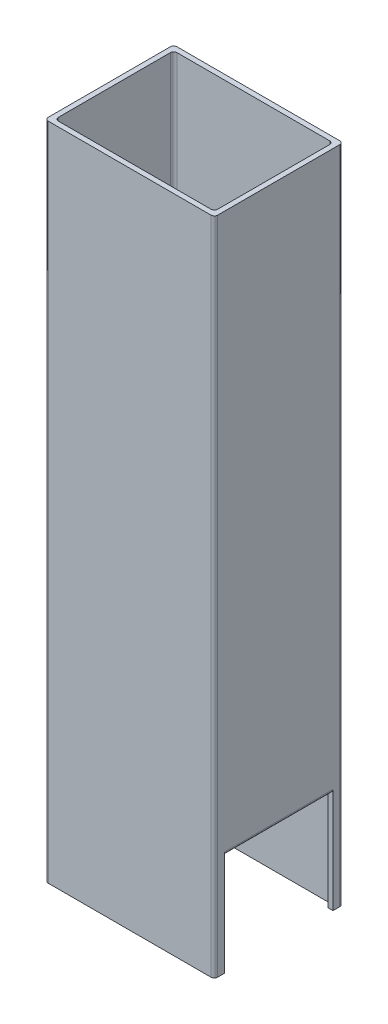
ISO-10303-21;
HEADER;
FILE_DESCRIPTION(('STEP AP214'),'2;1');
FILE_NAME('part.step','',(''),(''),'','','');
FILE_SCHEMA(('AUTOMOTIVE_DESIGN { 1 0 10303 214 1 1 1 1 }'));
ENDSEC;
DATA;
#1=APPLICATION_CONTEXT('core data for automotive mechanical design processes');
#2=APPLICATION_PROTOCOL_DEFINITION('international standard','automotive_design',2000,#1);
#3=PRODUCT_CONTEXT('',#1,'mechanical');
#4=PRODUCT('Part','Part','',(#3));
#5=PRODUCT_RELATED_PRODUCT_CATEGORY('part','',(#4));
#6=PRODUCT_DEFINITION_FORMATION('','',#4);
#7=PRODUCT_DEFINITION_CONTEXT('part definition',#1,'design');
#8=PRODUCT_DEFINITION('design','',#6,#7);
#9=PRODUCT_DEFINITION_SHAPE('','',#8);
#10=(LENGTH_UNIT() NAMED_UNIT(*) SI_UNIT(.MILLI.,.METRE.));
#11=(NAMED_UNIT(*) PLANE_ANGLE_UNIT() SI_UNIT($,.RADIAN.));
#12=(NAMED_UNIT(*) SI_UNIT($,.STERADIAN.) SOLID_ANGLE_UNIT());
#13=UNCERTAINTY_MEASURE_WITH_UNIT(LENGTH_MEASURE(1.E-05),#10,'distance_accuracy_value','');
#14=(GEOMETRIC_REPRESENTATION_CONTEXT(3) GLOBAL_UNCERTAINTY_ASSIGNED_CONTEXT((#13)) GLOBAL_UNIT_ASSIGNED_CONTEXT((#10,
#11,#12)) REPRESENTATION_CONTEXT('',''));
#15=CARTESIAN_POINT('',(0.,0.,0.));
#16=DIRECTION('',(0.,0.,1.));
#17=DIRECTION('',(1.,0.,0.));
#18=AXIS2_PLACEMENT_3D('',#15,#16,#17);
#19=CARTESIAN_POINT('',(0.,0.,0.));
#20=DIRECTION('',(0.,-1.,0.));
#21=DIRECTION('',(0.,0.,-1.));
#22=AXIS2_PLACEMENT_3D('',#19,#20,#21);
#23=PLANE('',#22);
#24=DIRECTION('',(1.,0.,0.));
#25=VECTOR('',#24,1.);
#26=CARTESIAN_POINT('',(-50.,0.,38.));
#27=LINE('',#26,#25);
#28=CARTESIAN_POINT('',(-48.,0.,38.));
#29=VERTEX_POINT('',#28);
#30=CARTESIAN_POINT('',(48.,0.,38.));
#31=VERTEX_POINT('',#30);
#32=EDGE_CURVE('E292',#29,#31,#27,.T.);
#33=ORIENTED_EDGE('',*,*,#32,.F.);
#34=CARTESIAN_POINT('',(-48.,0.,36.));
#35=DIRECTION('',(0.,-1.,0.));
#36=DIRECTION('',(0.,0.,-1.));
#37=AXIS2_PLACEMENT_3D('',#34,#35,#36);
#38=CIRCLE('',#37,2.);
#39=CARTESIAN_POINT('',(-50.,0.,36.));
#40=VERTEX_POINT('',#39);
#41=EDGE_CURVE('E356',#29,#40,#38,.T.);
#42=ORIENTED_EDGE('',*,*,#41,.T.);
#43=DIRECTION('',(0.,0.,1.));
#44=VECTOR('',#43,1.);
#45=CARTESIAN_POINT('',(-50.,0.,-38.));
#46=LINE('',#45,#44);
#47=CARTESIAN_POINT('',(-50.,0.,32.));
#48=VERTEX_POINT('',#47);
#49=EDGE_CURVE('E289',#48,#40,#46,.T.);
#50=ORIENTED_EDGE('',*,*,#49,.F.);
#51=DIRECTION('',(1.,0.,0.));
#52=VECTOR('',#51,1.);
#53=CARTESIAN_POINT('',(-50.,0.,32.));
#54=LINE('',#53,#52);
#55=CARTESIAN_POINT('',(-47.,0.,32.));
#56=VERTEX_POINT('',#55);
#57=EDGE_CURVE('E237',#48,#56,#54,.T.);
#58=ORIENTED_EDGE('',*,*,#57,.T.);
#59=DIRECTION('',(0.,0.,1.));
#60=VECTOR('',#59,1.);
#61=CARTESIAN_POINT('',(-47.,0.,-35.));
#62=LINE('',#61,#60);
#63=CARTESIAN_POINT('',(-47.,0.,33.));
#64=VERTEX_POINT('',#63);
#65=EDGE_CURVE('E251',#56,#64,#62,.T.);
#66=ORIENTED_EDGE('',*,*,#65,.T.);
#67=CARTESIAN_POINT('',(-45.,0.,33.));
#68=DIRECTION('',(0.,-1.,0.));
#69=DIRECTION('',(0.,0.,-1.));
#70=AXIS2_PLACEMENT_3D('',#67,#68,#69);
#71=CIRCLE('',#70,2.);
#72=CARTESIAN_POINT('',(-45.,0.,35.));
#73=VERTEX_POINT('',#72);
#74=EDGE_CURVE('E381',#64,#73,#71,.F.);
#75=ORIENTED_EDGE('',*,*,#74,.T.);
#76=DIRECTION('',(1.,0.,0.));
#77=VECTOR('',#76,1.);
#78=CARTESIAN_POINT('',(-47.,0.,35.));
#79=LINE('',#78,#77);
#80=CARTESIAN_POINT('',(45.,0.,35.));
#81=VERTEX_POINT('',#80);
#82=EDGE_CURVE('E268',#73,#81,#79,.T.);
#83=ORIENTED_EDGE('',*,*,#82,.T.);
#84=CARTESIAN_POINT('',(45.,0.,33.));
#85=DIRECTION('',(0.,-1.,0.));
#86=DIRECTION('',(0.,0.,-1.));
#87=AXIS2_PLACEMENT_3D('',#84,#85,#86);
#88=CIRCLE('',#87,2.);
#89=CARTESIAN_POINT('',(47.,0.,33.));
#90=VERTEX_POINT('',#89);
#91=EDGE_CURVE('E377',#81,#90,#88,.F.);
#92=ORIENTED_EDGE('',*,*,#91,.T.);
#93=DIRECTION('',(0.,0.,-1.));
#94=VECTOR('',#93,1.);
#95=CARTESIAN_POINT('',(47.,0.,-35.));
#96=LINE('',#95,#94);
#97=CARTESIAN_POINT('',(47.,0.,32.));
#98=VERTEX_POINT('',#97);
#99=EDGE_CURVE('E236',#90,#98,#96,.T.);
#100=ORIENTED_EDGE('',*,*,#99,.T.);
#101=CARTESIAN_POINT('',(50.,0.,32.));
#102=VERTEX_POINT('',#101);
#103=EDGE_CURVE('E226',#98,#102,#54,.T.);
#104=ORIENTED_EDGE('',*,*,#103,.T.);
#105=DIRECTION('',(0.,0.,-1.));
#106=VECTOR('',#105,1.);
#107=CARTESIAN_POINT('',(50.,0.,-38.));
#108=LINE('',#107,#106);
#109=CARTESIAN_POINT('',(50.,0.,36.));
#110=VERTEX_POINT('',#109);
#111=EDGE_CURVE('E209',#110,#102,#108,.T.);
#112=ORIENTED_EDGE('',*,*,#111,.F.);
#113=CARTESIAN_POINT('',(48.,0.,36.));
#114=DIRECTION('',(0.,-1.,0.));
#115=DIRECTION('',(0.,0.,-1.));
#116=AXIS2_PLACEMENT_3D('',#113,#114,#115);
#117=CIRCLE('',#116,2.);
#118=EDGE_CURVE('E354',#110,#31,#117,.T.);
#119=ORIENTED_EDGE('',*,*,#118,.T.);
#120=EDGE_LOOP('',(#33,#42,#50,#58,#66,#75,#83,#92,#100,#104,#112,#119));
#121=FACE_BOUND('',#120,.T.);
#122=ADVANCED_FACE('F33',(#121),#23,.T.);
#123=CARTESIAN_POINT('',(0.,389.5,0.));
#124=DIRECTION('',(0.,-1.,0.));
#125=DIRECTION('',(0.,0.,-1.));
#126=AXIS2_PLACEMENT_3D('',#123,#124,#125);
#127=PLANE('',#126);
#128=DIRECTION('',(0.,0.,-1.));
#129=VECTOR('',#128,1.);
#130=CARTESIAN_POINT('',(50.,389.5,-38.));
#131=LINE('',#130,#129);
#132=CARTESIAN_POINT('',(50.,389.5,36.));
#133=VERTEX_POINT('',#132);
#134=CARTESIAN_POINT('',(50.,389.5,-36.));
#135=VERTEX_POINT('',#134);
#136=EDGE_CURVE('E283',#133,#135,#131,.T.);
#137=ORIENTED_EDGE('',*,*,#136,.T.);
#138=CARTESIAN_POINT('',(48.,389.5,-36.));
#139=DIRECTION('',(0.,-1.,0.));
#140=DIRECTION('',(0.,0.,-1.));
#141=AXIS2_PLACEMENT_3D('',#138,#139,#140);
#142=CIRCLE('',#141,2.);
#143=CARTESIAN_POINT('',(48.,389.5,-38.));
#144=VERTEX_POINT('',#143);
#145=EDGE_CURVE('E347',#135,#144,#142,.F.);
#146=ORIENTED_EDGE('',*,*,#145,.T.);
#147=DIRECTION('',(-1.,0.,0.));
#148=VECTOR('',#147,1.);
#149=CARTESIAN_POINT('',(-50.,389.5,-38.));
#150=LINE('',#149,#148);
#151=CARTESIAN_POINT('',(-48.,389.5,-38.));
#152=VERTEX_POINT('',#151);
#153=EDGE_CURVE('E220',#144,#152,#150,.T.);
#154=ORIENTED_EDGE('',*,*,#153,.T.);
#155=CARTESIAN_POINT('',(-48.,389.5,-36.));
#156=DIRECTION('',(0.,-1.,0.));
#157=DIRECTION('',(0.,0.,-1.));
#158=AXIS2_PLACEMENT_3D('',#155,#156,#157);
#159=CIRCLE('',#158,2.);
#160=CARTESIAN_POINT('',(-50.,389.5,-36.));
#161=VERTEX_POINT('',#160);
#162=EDGE_CURVE('E345',#152,#161,#159,.F.);
#163=ORIENTED_EDGE('',*,*,#162,.T.);
#164=DIRECTION('',(0.,0.,1.));
#165=VECTOR('',#164,1.);
#166=CARTESIAN_POINT('',(-50.,389.5,-38.));
#167=LINE('',#166,#165);
#168=CARTESIAN_POINT('',(-50.,389.5,36.));
#169=VERTEX_POINT('',#168);
#170=EDGE_CURVE('E277',#161,#169,#167,.T.);
#171=ORIENTED_EDGE('',*,*,#170,.T.);
#172=CARTESIAN_POINT('',(-48.,389.5,36.));
#173=DIRECTION('',(0.,-1.,0.));
#174=DIRECTION('',(0.,0.,-1.));
#175=AXIS2_PLACEMENT_3D('',#172,#173,#174);
#176=CIRCLE('',#175,2.);
#177=CARTESIAN_POINT('',(-48.,389.5,38.));
#178=VERTEX_POINT('',#177);
#179=EDGE_CURVE('E343',#169,#178,#176,.F.);
#180=ORIENTED_EDGE('',*,*,#179,.T.);
#181=DIRECTION('',(1.,0.,0.));
#182=VECTOR('',#181,1.);
#183=CARTESIAN_POINT('',(-50.,389.5,38.));
#184=LINE('',#183,#182);
#185=CARTESIAN_POINT('',(48.,389.5,38.));
#186=VERTEX_POINT('',#185);
#187=EDGE_CURVE('E280',#178,#186,#184,.T.);
#188=ORIENTED_EDGE('',*,*,#187,.T.);
#189=CARTESIAN_POINT('',(48.,389.5,36.));
#190=DIRECTION('',(0.,-1.,0.));
#191=DIRECTION('',(0.,0.,-1.));
#192=AXIS2_PLACEMENT_3D('',#189,#190,#191);
#193=CIRCLE('',#192,2.);
#194=EDGE_CURVE('E341',#186,#133,#193,.F.);
#195=ORIENTED_EDGE('',*,*,#194,.T.);
#196=EDGE_LOOP('',(#137,#146,#154,#163,#171,#180,#188,#195));
#197=FACE_BOUND('',#196,.T.);
#198=DIRECTION('',(0.,0.,1.));
#199=VECTOR('',#198,1.);
#200=CARTESIAN_POINT('',(-47.,389.5,-35.));
#201=LINE('',#200,#199);
#202=CARTESIAN_POINT('',(-47.,389.5,-33.));
#203=VERTEX_POINT('',#202);
#204=CARTESIAN_POINT('',(-47.,389.5,33.));
#205=VERTEX_POINT('',#204);
#206=EDGE_CURVE('E252',#203,#205,#201,.T.);
#207=ORIENTED_EDGE('',*,*,#206,.F.);
#208=CARTESIAN_POINT('',(-45.,389.5,-33.));
#209=DIRECTION('',(0.,-1.,0.));
#210=DIRECTION('',(0.,0.,-1.));
#211=AXIS2_PLACEMENT_3D('',#208,#209,#210);
#212=CIRCLE('',#211,2.);
#213=CARTESIAN_POINT('',(-45.,389.5,-35.));
#214=VERTEX_POINT('',#213);
#215=EDGE_CURVE('E11',#203,#214,#212,.T.);
#216=ORIENTED_EDGE('',*,*,#215,.T.);
#217=DIRECTION('',(-1.,0.,0.));
#218=VECTOR('',#217,1.);
#219=CARTESIAN_POINT('',(-47.,389.5,-35.));
#220=LINE('',#219,#218);
#221=CARTESIAN_POINT('',(45.,389.5,-35.));
#222=VERTEX_POINT('',#221);
#223=EDGE_CURVE('E262',#222,#214,#220,.T.);
#224=ORIENTED_EDGE('',*,*,#223,.F.);
#225=CARTESIAN_POINT('',(45.,389.5,-33.));
#226=DIRECTION('',(0.,-1.,0.));
#227=DIRECTION('',(0.,0.,-1.));
#228=AXIS2_PLACEMENT_3D('',#225,#226,#227);
#229=CIRCLE('',#228,2.);
#230=CARTESIAN_POINT('',(47.,389.5,-33.));
#231=VERTEX_POINT('',#230);
#232=EDGE_CURVE('E387',#222,#231,#229,.T.);
#233=ORIENTED_EDGE('',*,*,#232,.T.);
#234=DIRECTION('',(0.,0.,-1.));
#235=VECTOR('',#234,1.);
#236=CARTESIAN_POINT('',(47.,389.5,-35.));
#237=LINE('',#236,#235);
#238=CARTESIAN_POINT('',(47.,389.5,33.));
#239=VERTEX_POINT('',#238);
#240=EDGE_CURVE('E259',#239,#231,#237,.T.);
#241=ORIENTED_EDGE('',*,*,#240,.F.);
#242=CARTESIAN_POINT('',(45.,389.5,33.));
#243=DIRECTION('',(0.,-1.,0.));
#244=DIRECTION('',(0.,0.,-1.));
#245=AXIS2_PLACEMENT_3D('',#242,#243,#244);
#246=CIRCLE('',#245,2.);
#247=CARTESIAN_POINT('',(45.,389.5,35.));
#248=VERTEX_POINT('',#247);
#249=EDGE_CURVE('E379',#239,#248,#246,.T.);
#250=ORIENTED_EDGE('',*,*,#249,.T.);
#251=DIRECTION('',(1.,0.,0.));
#252=VECTOR('',#251,1.);
#253=CARTESIAN_POINT('',(-47.,389.5,35.));
#254=LINE('',#253,#252);
#255=CARTESIAN_POINT('',(-45.,389.5,35.));
#256=VERTEX_POINT('',#255);
#257=EDGE_CURVE('E255',#256,#248,#254,.T.);
#258=ORIENTED_EDGE('',*,*,#257,.F.);
#259=CARTESIAN_POINT('',(-45.,389.5,33.));
#260=DIRECTION('',(0.,-1.,0.));
#261=DIRECTION('',(0.,0.,-1.));
#262=AXIS2_PLACEMENT_3D('',#259,#260,#261);
#263=CIRCLE('',#262,2.);
#264=EDGE_CURVE('E383',#256,#205,#263,.T.);
#265=ORIENTED_EDGE('',*,*,#264,.T.);
#266=EDGE_LOOP('',(#207,#216,#224,#233,#241,#250,#258,#265));
#267=FACE_BOUND('',#266,.T.);
#268=ADVANCED_FACE('F455',(#197,#267),#127,.F.);
#269=DIRECTION('',(-1.,0.,0.));
#270=VECTOR('',#269,1.);
#271=CARTESIAN_POINT('',(-50.,0.,-38.));
#272=LINE('',#271,#270);
#273=CARTESIAN_POINT('',(48.,0.,-38.));
#274=VERTEX_POINT('',#273);
#275=CARTESIAN_POINT('',(-48.,0.,-38.));
#276=VERTEX_POINT('',#275);
#277=EDGE_CURVE('E265',#274,#276,#272,.T.);
#278=ORIENTED_EDGE('',*,*,#277,.F.);
#279=CARTESIAN_POINT('',(48.,0.,-36.));
#280=DIRECTION('',(0.,-1.,0.));
#281=DIRECTION('',(0.,0.,-1.));
#282=AXIS2_PLACEMENT_3D('',#279,#280,#281);
#283=CIRCLE('',#282,2.);
#284=CARTESIAN_POINT('',(50.,0.,-36.));
#285=VERTEX_POINT('',#284);
#286=EDGE_CURVE('E339',#274,#285,#283,.T.);
#287=ORIENTED_EDGE('',*,*,#286,.T.);
#288=CARTESIAN_POINT('',(50.,0.,-32.));
#289=VERTEX_POINT('',#288);
#290=EDGE_CURVE('E221',#289,#285,#108,.T.);
#291=ORIENTED_EDGE('',*,*,#290,.F.);
#292=DIRECTION('',(1.,0.,0.));
#293=VECTOR('',#292,1.);
#294=CARTESIAN_POINT('',(-50.,0.,-32.));
#295=LINE('',#294,#293);
#296=CARTESIAN_POINT('',(47.,0.,-32.));
#297=VERTEX_POINT('',#296);
#298=EDGE_CURVE('E241',#297,#289,#295,.T.);
#299=ORIENTED_EDGE('',*,*,#298,.F.);
#300=CARTESIAN_POINT('',(47.,0.,-33.));
#301=VERTEX_POINT('',#300);
#302=EDGE_CURVE('E271',#297,#301,#96,.T.);
#303=ORIENTED_EDGE('',*,*,#302,.T.);
#304=CARTESIAN_POINT('',(45.,0.,-33.));
#305=DIRECTION('',(0.,-1.,0.));
#306=DIRECTION('',(0.,0.,-1.));
#307=AXIS2_PLACEMENT_3D('',#304,#305,#306);
#308=CIRCLE('',#307,2.);
#309=CARTESIAN_POINT('',(45.,0.,-35.));
#310=VERTEX_POINT('',#309);
#311=EDGE_CURVE('E385',#301,#310,#308,.F.);
#312=ORIENTED_EDGE('',*,*,#311,.T.);
#313=DIRECTION('',(-1.,0.,0.));
#314=VECTOR('',#313,1.);
#315=CARTESIAN_POINT('',(-47.,0.,-35.));
#316=LINE('',#315,#314);
#317=CARTESIAN_POINT('',(-45.,0.,-35.));
#318=VERTEX_POINT('',#317);
#319=EDGE_CURVE('E256',#310,#318,#316,.T.);
#320=ORIENTED_EDGE('',*,*,#319,.T.);
#321=CARTESIAN_POINT('',(-45.,0.,-33.));
#322=DIRECTION('',(0.,-1.,0.));
#323=DIRECTION('',(0.,0.,-1.));
#324=AXIS2_PLACEMENT_3D('',#321,#322,#323);
#325=CIRCLE('',#324,2.);
#326=CARTESIAN_POINT('',(-47.,0.,-33.));
#327=VERTEX_POINT('',#326);
#328=EDGE_CURVE('E42',#318,#327,#325,.F.);
#329=ORIENTED_EDGE('',*,*,#328,.T.);
#330=CARTESIAN_POINT('',(-47.,0.,-32.));
#331=VERTEX_POINT('',#330);
#332=EDGE_CURVE('E266',#327,#331,#62,.T.);
#333=ORIENTED_EDGE('',*,*,#332,.T.);
#334=CARTESIAN_POINT('',(-50.,0.,-32.));
#335=VERTEX_POINT('',#334);
#336=EDGE_CURVE('E246',#335,#331,#295,.T.);
#337=ORIENTED_EDGE('',*,*,#336,.F.);
#338=CARTESIAN_POINT('',(-50.,0.,-36.));
#339=VERTEX_POINT('',#338);
#340=EDGE_CURVE('E290',#339,#335,#46,.T.);
#341=ORIENTED_EDGE('',*,*,#340,.F.);
#342=CARTESIAN_POINT('',(-48.,0.,-36.));
#343=DIRECTION('',(0.,-1.,0.));
#344=DIRECTION('',(0.,0.,-1.));
#345=AXIS2_PLACEMENT_3D('',#342,#343,#344);
#346=CIRCLE('',#345,2.);
#347=EDGE_CURVE('E337',#339,#276,#346,.T.);
#348=ORIENTED_EDGE('',*,*,#347,.T.);
#349=EDGE_LOOP('',(#278,#287,#291,#299,#303,#312,#320,#329,#333,#337,#341,#348));
#350=FACE_BOUND('',#349,.T.);
#351=ADVANCED_FACE('F442',(#350),#23,.T.);
#352=CARTESIAN_POINT('',(-50.,389.5,-38.));
#353=DIRECTION('',(0.,0.,1.));
#354=DIRECTION('',(1.,0.,0.));
#355=AXIS2_PLACEMENT_3D('',#352,#353,#354);
#356=PLANE('',#355);
#357=ORIENTED_EDGE('',*,*,#153,.F.);
#358=DIRECTION('',(0.,-1.,0.));
#359=VECTOR('',#358,1.);
#360=CARTESIAN_POINT('',(48.,389.5,-38.));
#361=LINE('',#360,#359);
#362=EDGE_CURVE('E334',#144,#274,#361,.T.);
#363=ORIENTED_EDGE('',*,*,#362,.T.);
#364=ORIENTED_EDGE('',*,*,#277,.T.);
#365=DIRECTION('',(0.,-1.,0.));
#366=VECTOR('',#365,1.);
#367=CARTESIAN_POINT('',(-48.,389.5,-38.));
#368=LINE('',#367,#366);
#369=EDGE_CURVE('E332',#276,#152,#368,.F.);
#370=ORIENTED_EDGE('',*,*,#369,.T.);
#371=EDGE_LOOP('',(#357,#363,#364,#370));
#372=FACE_BOUND('',#371,.T.);
#373=ADVANCED_FACE('F451',(#372),#356,.F.);
#374=CARTESIAN_POINT('',(-50.,389.5,-38.));
#375=DIRECTION('',(1.,0.,0.));
#376=DIRECTION('',(0.,0.,-1.));
#377=AXIS2_PLACEMENT_3D('',#374,#375,#376);
#378=PLANE('',#377);
#379=DIRECTION('',(0.,0.,1.));
#380=VECTOR('',#379,1.);
#381=CARTESIAN_POINT('',(-50.,62.,-38.0000000000001));
#382=LINE('',#381,#380);
#383=CARTESIAN_POINT('',(-50.,62.,-32.));
#384=VERTEX_POINT('',#383);
#385=CARTESIAN_POINT('',(-50.,62.,32.));
#386=VERTEX_POINT('',#385);
#387=EDGE_CURVE('E316',#384,#386,#382,.T.);
#388=ORIENTED_EDGE('',*,*,#387,.T.);
#389=DIRECTION('',(0.,-1.,0.));
#390=VECTOR('',#389,1.);
#391=CARTESIAN_POINT('',(-50.,0.,32.));
#392=LINE('',#391,#390);
#393=EDGE_CURVE('E242',#386,#48,#392,.T.);
#394=ORIENTED_EDGE('',*,*,#393,.T.);
#395=ORIENTED_EDGE('',*,*,#49,.T.);
#396=DIRECTION('',(0.,-1.,0.));
#397=VECTOR('',#396,1.);
#398=CARTESIAN_POINT('',(-50.,389.5,36.));
#399=LINE('',#398,#397);
#400=EDGE_CURVE('E311',#40,#169,#399,.F.);
#401=ORIENTED_EDGE('',*,*,#400,.T.);
#402=ORIENTED_EDGE('',*,*,#170,.F.);
#403=DIRECTION('',(0.,-1.,0.));
#404=VECTOR('',#403,1.);
#405=CARTESIAN_POINT('',(-50.,389.5,-36.));
#406=LINE('',#405,#404);
#407=EDGE_CURVE('E313',#161,#339,#406,.T.);
#408=ORIENTED_EDGE('',*,*,#407,.T.);
#409=ORIENTED_EDGE('',*,*,#340,.T.);
#410=DIRECTION('',(0.,1.,0.));
#411=VECTOR('',#410,1.);
#412=CARTESIAN_POINT('',(-50.,0.,-32.));
#413=LINE('',#412,#411);
#414=EDGE_CURVE('E238',#335,#384,#413,.T.);
#415=ORIENTED_EDGE('',*,*,#414,.T.);
#416=EDGE_LOOP('',(#388,#394,#395,#401,#402,#408,#409,#415));
#417=FACE_BOUND('',#416,.T.);
#418=ADVANCED_FACE('F463',(#417),#378,.F.);
#419=CARTESIAN_POINT('',(-50.,389.5,38.));
#420=DIRECTION('',(0.,0.,-1.));
#421=DIRECTION('',(-1.,0.,0.));
#422=AXIS2_PLACEMENT_3D('',#419,#420,#421);
#423=PLANE('',#422);
#424=ORIENTED_EDGE('',*,*,#187,.F.);
#425=DIRECTION('',(0.,-1.,0.));
#426=VECTOR('',#425,1.);
#427=CARTESIAN_POINT('',(-48.,389.5,38.));
#428=LINE('',#427,#426);
#429=EDGE_CURVE('E351',#178,#29,#428,.T.);
#430=ORIENTED_EDGE('',*,*,#429,.T.);
#431=ORIENTED_EDGE('',*,*,#32,.T.);
#432=DIRECTION('',(0.,-1.,0.));
#433=VECTOR('',#432,1.);
#434=CARTESIAN_POINT('',(48.,389.5,38.));
#435=LINE('',#434,#433);
#436=EDGE_CURVE('E349',#31,#186,#435,.F.);
#437=ORIENTED_EDGE('',*,*,#436,.T.);
#438=EDGE_LOOP('',(#424,#430,#431,#437));
#439=FACE_BOUND('',#438,.T.);
#440=ADVANCED_FACE('F509',(#439),#423,.F.);
#441=CARTESIAN_POINT('',(50.,389.5,-38.));
#442=DIRECTION('',(-1.,0.,0.));
#443=DIRECTION('',(0.,0.,1.));
#444=AXIS2_PLACEMENT_3D('',#441,#442,#443);
#445=PLANE('',#444);
#446=DIRECTION('',(0.,-1.,0.));
#447=VECTOR('',#446,1.);
#448=CARTESIAN_POINT('',(50.,0.,32.));
#449=LINE('',#448,#447);
#450=CARTESIAN_POINT('',(50.,62.,32.));
#451=VERTEX_POINT('',#450);
#452=EDGE_CURVE('E213',#451,#102,#449,.T.);
#453=ORIENTED_EDGE('',*,*,#452,.F.);
#454=DIRECTION('',(0.,0.,1.));
#455=VECTOR('',#454,1.);
#456=CARTESIAN_POINT('',(50.,62.,-38.0000000000001));
#457=LINE('',#456,#455);
#458=CARTESIAN_POINT('',(50.,62.,-32.));
#459=VERTEX_POINT('',#458);
#460=EDGE_CURVE('E301',#451,#459,#457,.F.);
#461=ORIENTED_EDGE('',*,*,#460,.T.);
#462=DIRECTION('',(0.,1.,0.));
#463=VECTOR('',#462,1.);
#464=CARTESIAN_POINT('',(50.,0.,-32.));
#465=LINE('',#464,#463);
#466=EDGE_CURVE('E231',#289,#459,#465,.T.);
#467=ORIENTED_EDGE('',*,*,#466,.F.);
#468=ORIENTED_EDGE('',*,*,#290,.T.);
#469=DIRECTION('',(0.,-1.,0.));
#470=VECTOR('',#469,1.);
#471=CARTESIAN_POINT('',(50.,389.5,-36.));
#472=LINE('',#471,#470);
#473=EDGE_CURVE('E299',#285,#135,#472,.F.);
#474=ORIENTED_EDGE('',*,*,#473,.T.);
#475=ORIENTED_EDGE('',*,*,#136,.F.);
#476=DIRECTION('',(0.,-1.,0.));
#477=VECTOR('',#476,1.);
#478=CARTESIAN_POINT('',(50.,389.5,36.));
#479=LINE('',#478,#477);
#480=EDGE_CURVE('E217',#133,#110,#479,.T.);
#481=ORIENTED_EDGE('',*,*,#480,.T.);
#482=ORIENTED_EDGE('',*,*,#111,.T.);
#483=EDGE_LOOP('',(#453,#461,#467,#468,#474,#475,#481,#482));
#484=FACE_BOUND('',#483,.T.);
#485=ADVANCED_FACE('F211',(#484),#445,.F.);
#486=CARTESIAN_POINT('',(-47.,389.5,-35.));
#487=DIRECTION('',(1.,0.,0.));
#488=DIRECTION('',(0.,0.,-1.));
#489=AXIS2_PLACEMENT_3D('',#486,#487,#488);
#490=PLANE('',#489);
#491=DIRECTION('',(0.,-1.,0.));
#492=VECTOR('',#491,1.);
#493=CARTESIAN_POINT('',(-47.,389.5,32.));
#494=LINE('',#493,#492);
#495=CARTESIAN_POINT('',(-47.,62.,32.));
#496=VERTEX_POINT('',#495);
#497=EDGE_CURVE('E249',#496,#56,#494,.T.);
#498=ORIENTED_EDGE('',*,*,#497,.F.);
#499=DIRECTION('',(0.,0.,1.));
#500=VECTOR('',#499,1.);
#501=CARTESIAN_POINT('',(-47.,62.,-32.));
#502=LINE('',#501,#500);
#503=CARTESIAN_POINT('',(-47.,62.,-32.));
#504=VERTEX_POINT('',#503);
#505=EDGE_CURVE('E324',#496,#504,#502,.F.);
#506=ORIENTED_EDGE('',*,*,#505,.T.);
#507=DIRECTION('',(0.,1.,0.));
#508=VECTOR('',#507,1.);
#509=CARTESIAN_POINT('',(-47.,389.5,-31.9999999999998));
#510=LINE('',#509,#508);
#511=EDGE_CURVE('E247',#331,#504,#510,.T.);
#512=ORIENTED_EDGE('',*,*,#511,.F.);
#513=ORIENTED_EDGE('',*,*,#332,.F.);
#514=DIRECTION('',(0.,-1.,0.));
#515=VECTOR('',#514,1.);
#516=CARTESIAN_POINT('',(-47.,389.5,-33.));
#517=LINE('',#516,#515);
#518=EDGE_CURVE('E319',#327,#203,#517,.F.);
#519=ORIENTED_EDGE('',*,*,#518,.T.);
#520=ORIENTED_EDGE('',*,*,#206,.T.);
#521=DIRECTION('',(0.,-1.,0.));
#522=VECTOR('',#521,1.);
#523=CARTESIAN_POINT('',(-47.,0.,33.));
#524=LINE('',#523,#522);
#525=EDGE_CURVE('E321',#205,#64,#524,.T.);
#526=ORIENTED_EDGE('',*,*,#525,.T.);
#527=ORIENTED_EDGE('',*,*,#65,.F.);
#528=EDGE_LOOP('',(#498,#506,#512,#513,#519,#520,#526,#527));
#529=FACE_BOUND('',#528,.T.);
#530=ADVANCED_FACE('F408',(#529),#490,.T.);
#531=CARTESIAN_POINT('',(-47.,389.5,35.));
#532=DIRECTION('',(0.,0.,-1.));
#533=DIRECTION('',(-1.,0.,0.));
#534=AXIS2_PLACEMENT_3D('',#531,#532,#533);
#535=PLANE('',#534);
#536=ORIENTED_EDGE('',*,*,#257,.T.);
#537=DIRECTION('',(0.,-1.,0.));
#538=VECTOR('',#537,1.);
#539=CARTESIAN_POINT('',(45.,0.,35.));
#540=LINE('',#539,#538);
#541=EDGE_CURVE('E329',#248,#81,#540,.T.);
#542=ORIENTED_EDGE('',*,*,#541,.T.);
#543=ORIENTED_EDGE('',*,*,#82,.F.);
#544=DIRECTION('',(0.,-1.,0.));
#545=VECTOR('',#544,1.);
#546=CARTESIAN_POINT('',(-45.,389.5,35.));
#547=LINE('',#546,#545);
#548=EDGE_CURVE('E327',#73,#256,#547,.F.);
#549=ORIENTED_EDGE('',*,*,#548,.T.);
#550=EDGE_LOOP('',(#536,#542,#543,#549));
#551=FACE_BOUND('',#550,.T.);
#552=ADVANCED_FACE('F417',(#551),#535,.T.);
#553=CARTESIAN_POINT('',(47.,389.5,-35.));
#554=DIRECTION('',(-1.,0.,0.));
#555=DIRECTION('',(0.,0.,1.));
#556=AXIS2_PLACEMENT_3D('',#553,#554,#555);
#557=PLANE('',#556);
#558=DIRECTION('',(0.,-1.,0.));
#559=VECTOR('',#558,1.);
#560=CARTESIAN_POINT('',(47.,389.5,-31.9999999999998));
#561=LINE('',#560,#559);
#562=CARTESIAN_POINT('',(47.,62.,-32.));
#563=VERTEX_POINT('',#562);
#564=EDGE_CURVE('E286',#563,#297,#561,.T.);
#565=ORIENTED_EDGE('',*,*,#564,.F.);
#566=DIRECTION('',(0.,0.,-1.));
#567=VECTOR('',#566,1.);
#568=CARTESIAN_POINT('',(47.,62.,32.));
#569=LINE('',#568,#567);
#570=CARTESIAN_POINT('',(47.,62.,32.));
#571=VERTEX_POINT('',#570);
#572=EDGE_CURVE('E308',#563,#571,#569,.F.);
#573=ORIENTED_EDGE('',*,*,#572,.T.);
#574=DIRECTION('',(0.,1.,0.));
#575=VECTOR('',#574,1.);
#576=CARTESIAN_POINT('',(47.,389.5,32.));
#577=LINE('',#576,#575);
#578=EDGE_CURVE('E296',#98,#571,#577,.T.);
#579=ORIENTED_EDGE('',*,*,#578,.F.);
#580=ORIENTED_EDGE('',*,*,#99,.F.);
#581=DIRECTION('',(0.,-1.,0.));
#582=VECTOR('',#581,1.);
#583=CARTESIAN_POINT('',(47.,389.5,33.));
#584=LINE('',#583,#582);
#585=EDGE_CURVE('E306',#90,#239,#584,.F.);
#586=ORIENTED_EDGE('',*,*,#585,.T.);
#587=ORIENTED_EDGE('',*,*,#240,.T.);
#588=DIRECTION('',(0.,-1.,0.));
#589=VECTOR('',#588,1.);
#590=CARTESIAN_POINT('',(47.,0.,-33.));
#591=LINE('',#590,#589);
#592=EDGE_CURVE('E303',#231,#301,#591,.T.);
#593=ORIENTED_EDGE('',*,*,#592,.T.);
#594=ORIENTED_EDGE('',*,*,#302,.F.);
#595=EDGE_LOOP('',(#565,#573,#579,#580,#586,#587,#593,#594));
#596=FACE_BOUND('',#595,.T.);
#597=ADVANCED_FACE('F425',(#596),#557,.T.);
#598=CARTESIAN_POINT('',(-47.,389.5,-35.));
#599=DIRECTION('',(0.,0.,1.));
#600=DIRECTION('',(1.,0.,0.));
#601=AXIS2_PLACEMENT_3D('',#598,#599,#600);
#602=PLANE('',#601);
#603=ORIENTED_EDGE('',*,*,#319,.F.);
#604=DIRECTION('',(0.,-1.,0.));
#605=VECTOR('',#604,1.);
#606=CARTESIAN_POINT('',(45.,389.5,-35.));
#607=LINE('',#606,#605);
#608=EDGE_CURVE('E361',#310,#222,#607,.F.);
#609=ORIENTED_EDGE('',*,*,#608,.T.);
#610=ORIENTED_EDGE('',*,*,#223,.T.);
#611=DIRECTION('',(0.,-1.,0.));
#612=VECTOR('',#611,1.);
#613=CARTESIAN_POINT('',(-45.,0.,-35.));
#614=LINE('',#613,#612);
#615=EDGE_CURVE('E358',#214,#318,#614,.T.);
#616=ORIENTED_EDGE('',*,*,#615,.T.);
#617=EDGE_LOOP('',(#603,#609,#610,#616));
#618=FACE_BOUND('',#617,.T.);
#619=ADVANCED_FACE('F475',(#618),#602,.T.);
#620=CARTESIAN_POINT('',(-50.,0.,-32.));
#621=DIRECTION('',(0.,0.,-1.));
#622=DIRECTION('',(0.,1.,0.));
#623=AXIS2_PLACEMENT_3D('',#620,#621,#622);
#624=PLANE('',#623);
#625=ORIENTED_EDGE('',*,*,#564,.T.);
#626=ORIENTED_EDGE('',*,*,#298,.T.);
#627=ORIENTED_EDGE('',*,*,#466,.T.);
#628=CARTESIAN_POINT('',(48.,62.,-32.));
#629=DIRECTION('',(0.,0.,-1.));
#630=DIRECTION('',(0.,1.,0.));
#631=AXIS2_PLACEMENT_3D('',#628,#629,#630);
#632=CIRCLE('',#631,2.);
#633=CARTESIAN_POINT('',(48.5,60.0635083268963,-32.));
#634=VERTEX_POINT('',#633);
#635=EDGE_CURVE('E364',#459,#634,#632,.T.);
#636=ORIENTED_EDGE('',*,*,#635,.T.);
#637=CARTESIAN_POINT('',(49.,62.,-32.));
#638=DIRECTION('',(0.,0.,-1.));
#639=DIRECTION('',(0.,1.,0.));
#640=AXIS2_PLACEMENT_3D('',#637,#638,#639);
#641=CIRCLE('',#640,2.);
#642=EDGE_CURVE('E366',#634,#563,#641,.T.);
#643=ORIENTED_EDGE('',*,*,#642,.T.);
#644=EDGE_LOOP('',(#625,#626,#627,#636,#643));
#645=FACE_BOUND('',#644,.T.);
#646=ADVANCED_FACE('F469',(#645),#624,.F.);
#647=CARTESIAN_POINT('',(-50.,0.,32.));
#648=DIRECTION('',(0.,0.,1.));
#649=DIRECTION('',(1.,0.,0.));
#650=AXIS2_PLACEMENT_3D('',#647,#648,#649);
#651=PLANE('',#650);
#652=ORIENTED_EDGE('',*,*,#578,.T.);
#653=CARTESIAN_POINT('',(49.,62.,32.));
#654=DIRECTION('',(0.,0.,1.));
#655=DIRECTION('',(1.,0.,0.));
#656=AXIS2_PLACEMENT_3D('',#653,#654,#655);
#657=CIRCLE('',#656,2.);
#658=CARTESIAN_POINT('',(48.5,60.0635083268963,32.));
#659=VERTEX_POINT('',#658);
#660=EDGE_CURVE('E369',#571,#659,#657,.T.);
#661=ORIENTED_EDGE('',*,*,#660,.T.);
#662=CARTESIAN_POINT('',(48.,62.,32.));
#663=DIRECTION('',(0.,0.,1.));
#664=DIRECTION('',(1.,0.,0.));
#665=AXIS2_PLACEMENT_3D('',#662,#663,#664);
#666=CIRCLE('',#665,2.);
#667=EDGE_CURVE('E229',#659,#451,#666,.T.);
#668=ORIENTED_EDGE('',*,*,#667,.T.);
#669=ORIENTED_EDGE('',*,*,#452,.T.);
#670=ORIENTED_EDGE('',*,*,#103,.F.);
#671=EDGE_LOOP('',(#652,#661,#668,#669,#670));
#672=FACE_BOUND('',#671,.T.);
#673=ADVANCED_FACE('F225',(#672),#651,.F.);
#674=ORIENTED_EDGE('',*,*,#497,.T.);
#675=ORIENTED_EDGE('',*,*,#57,.F.);
#676=ORIENTED_EDGE('',*,*,#393,.F.);
#677=CARTESIAN_POINT('',(-48.,62.,32.));
#678=DIRECTION('',(0.,0.,1.));
#679=DIRECTION('',(1.,0.,0.));
#680=AXIS2_PLACEMENT_3D('',#677,#678,#679);
#681=CIRCLE('',#680,2.);
#682=CARTESIAN_POINT('',(-48.5,60.0635083268963,32.));
#683=VERTEX_POINT('',#682);
#684=EDGE_CURVE('E58',#386,#683,#681,.T.);
#685=ORIENTED_EDGE('',*,*,#684,.T.);
#686=CARTESIAN_POINT('',(-49.,62.,32.));
#687=DIRECTION('',(0.,0.,1.));
#688=DIRECTION('',(1.,0.,0.));
#689=AXIS2_PLACEMENT_3D('',#686,#687,#688);
#690=CIRCLE('',#689,2.);
#691=EDGE_CURVE('E374',#683,#496,#690,.T.);
#692=ORIENTED_EDGE('',*,*,#691,.T.);
#693=EDGE_LOOP('',(#674,#675,#676,#685,#692));
#694=FACE_BOUND('',#693,.T.);
#695=ADVANCED_FACE('F401',(#694),#651,.F.);
#696=ORIENTED_EDGE('',*,*,#511,.T.);
#697=CARTESIAN_POINT('',(-49.,62.,-32.));
#698=DIRECTION('',(0.,0.,-1.));
#699=DIRECTION('',(0.,1.,0.));
#700=AXIS2_PLACEMENT_3D('',#697,#698,#699);
#701=CIRCLE('',#700,2.);
#702=CARTESIAN_POINT('',(-48.5,60.0635083268963,-32.));
#703=VERTEX_POINT('',#702);
#704=EDGE_CURVE('E50',#504,#703,#701,.T.);
#705=ORIENTED_EDGE('',*,*,#704,.T.);
#706=CARTESIAN_POINT('',(-48.,62.,-32.));
#707=DIRECTION('',(0.,0.,-1.));
#708=DIRECTION('',(0.,1.,0.));
#709=AXIS2_PLACEMENT_3D('',#706,#707,#708);
#710=CIRCLE('',#709,2.);
#711=EDGE_CURVE('E372',#703,#384,#710,.T.);
#712=ORIENTED_EDGE('',*,*,#711,.T.);
#713=ORIENTED_EDGE('',*,*,#414,.F.);
#714=ORIENTED_EDGE('',*,*,#336,.T.);
#715=EDGE_LOOP('',(#696,#705,#712,#713,#714));
#716=FACE_BOUND('',#715,.T.);
#717=ADVANCED_FACE('F483',(#716),#624,.F.);
#718=CARTESIAN_POINT('',(49.,62.,32.));
#719=DIRECTION('',(0.,0.,1.));
#720=DIRECTION('',(0.,-1.,0.));
#721=AXIS2_PLACEMENT_3D('',#718,#719,#720);
#722=CYLINDRICAL_SURFACE('',#721,2.);
#723=ORIENTED_EDGE('',*,*,#572,.F.);
#724=ORIENTED_EDGE('',*,*,#642,.F.);
#725=DIRECTION('',(0.,0.,1.));
#726=VECTOR('',#725,1.);
#727=CARTESIAN_POINT('',(48.5,60.0635083268963,0.));
#728=LINE('',#727,#726);
#729=EDGE_CURVE('E232',#659,#634,#728,.F.);
#730=ORIENTED_EDGE('',*,*,#729,.F.);
#731=ORIENTED_EDGE('',*,*,#660,.F.);
#732=EDGE_LOOP('',(#723,#724,#730,#731));
#733=FACE_BOUND('',#732,.T.);
#734=ADVANCED_FACE('F431',(#733),#722,.T.);
#735=CARTESIAN_POINT('',(48.,62.,32.));
#736=DIRECTION('',(0.,0.,1.));
#737=DIRECTION('',(0.,-1.,0.));
#738=AXIS2_PLACEMENT_3D('',#735,#736,#737);
#739=CYLINDRICAL_SURFACE('',#738,2.);
#740=ORIENTED_EDGE('',*,*,#635,.F.);
#741=ORIENTED_EDGE('',*,*,#460,.F.);
#742=ORIENTED_EDGE('',*,*,#667,.F.);
#743=ORIENTED_EDGE('',*,*,#729,.T.);
#744=EDGE_LOOP('',(#740,#741,#742,#743));
#745=FACE_BOUND('',#744,.T.);
#746=ADVANCED_FACE('F432',(#745),#739,.T.);
#747=CARTESIAN_POINT('',(-49.,62.,32.));
#748=DIRECTION('',(0.,0.,-1.));
#749=DIRECTION('',(0.,1.,0.));
#750=AXIS2_PLACEMENT_3D('',#747,#748,#749);
#751=CYLINDRICAL_SURFACE('',#750,2.);
#752=DIRECTION('',(0.,0.,-1.));
#753=VECTOR('',#752,1.);
#754=CARTESIAN_POINT('',(-48.5,60.0635083268963,0.));
#755=LINE('',#754,#753);
#756=EDGE_CURVE('E37',#703,#683,#755,.F.);
#757=ORIENTED_EDGE('',*,*,#756,.F.);
#758=ORIENTED_EDGE('',*,*,#704,.F.);
#759=ORIENTED_EDGE('',*,*,#505,.F.);
#760=ORIENTED_EDGE('',*,*,#691,.F.);
#761=EDGE_LOOP('',(#757,#758,#759,#760));
#762=FACE_BOUND('',#761,.T.);
#763=ADVANCED_FACE('F399',(#762),#751,.T.);
#764=CARTESIAN_POINT('',(-48.,62.,-38.0000000000001));
#765=DIRECTION('',(0.,0.,1.));
#766=DIRECTION('',(0.,-1.,0.));
#767=AXIS2_PLACEMENT_3D('',#764,#765,#766);
#768=CYLINDRICAL_SURFACE('',#767,2.);
#769=ORIENTED_EDGE('',*,*,#711,.F.);
#770=ORIENTED_EDGE('',*,*,#756,.T.);
#771=ORIENTED_EDGE('',*,*,#684,.F.);
#772=ORIENTED_EDGE('',*,*,#387,.F.);
#773=EDGE_LOOP('',(#769,#770,#771,#772));
#774=FACE_BOUND('',#773,.T.);
#775=ADVANCED_FACE('F396',(#774),#768,.T.);
#776=CARTESIAN_POINT('',(45.,389.5,33.));
#777=DIRECTION('',(0.,1.,0.));
#778=DIRECTION('',(0.,0.,1.));
#779=AXIS2_PLACEMENT_3D('',#776,#777,#778);
#780=CYLINDRICAL_SURFACE('',#779,2.);
#781=ORIENTED_EDGE('',*,*,#249,.F.);
#782=ORIENTED_EDGE('',*,*,#585,.F.);
#783=ORIENTED_EDGE('',*,*,#91,.F.);
#784=ORIENTED_EDGE('',*,*,#541,.F.);
#785=EDGE_LOOP('',(#781,#782,#783,#784));
#786=FACE_BOUND('',#785,.T.);
#787=ADVANCED_FACE('F422',(#786),#780,.F.);
#788=CARTESIAN_POINT('',(-45.,389.5,33.));
#789=DIRECTION('',(0.,1.,0.));
#790=DIRECTION('',(0.,0.,1.));
#791=AXIS2_PLACEMENT_3D('',#788,#789,#790);
#792=CYLINDRICAL_SURFACE('',#791,2.);
#793=ORIENTED_EDGE('',*,*,#264,.F.);
#794=ORIENTED_EDGE('',*,*,#548,.F.);
#795=ORIENTED_EDGE('',*,*,#74,.F.);
#796=ORIENTED_EDGE('',*,*,#525,.F.);
#797=EDGE_LOOP('',(#793,#794,#795,#796));
#798=FACE_BOUND('',#797,.T.);
#799=ADVANCED_FACE('F413',(#798),#792,.F.);
#800=CARTESIAN_POINT('',(48.,389.5,-36.));
#801=DIRECTION('',(0.,-1.,0.));
#802=DIRECTION('',(0.,0.,-1.));
#803=AXIS2_PLACEMENT_3D('',#800,#801,#802);
#804=CYLINDRICAL_SURFACE('',#803,2.);
#805=ORIENTED_EDGE('',*,*,#145,.F.);
#806=ORIENTED_EDGE('',*,*,#473,.F.);
#807=ORIENTED_EDGE('',*,*,#286,.F.);
#808=ORIENTED_EDGE('',*,*,#362,.F.);
#809=EDGE_LOOP('',(#805,#806,#807,#808));
#810=FACE_BOUND('',#809,.T.);
#811=ADVANCED_FACE('F448',(#810),#804,.T.);
#812=CARTESIAN_POINT('',(-48.,389.5,-36.));
#813=DIRECTION('',(0.,-1.,0.));
#814=DIRECTION('',(0.,0.,-1.));
#815=AXIS2_PLACEMENT_3D('',#812,#813,#814);
#816=CYLINDRICAL_SURFACE('',#815,2.);
#817=ORIENTED_EDGE('',*,*,#162,.F.);
#818=ORIENTED_EDGE('',*,*,#369,.F.);
#819=ORIENTED_EDGE('',*,*,#347,.F.);
#820=ORIENTED_EDGE('',*,*,#407,.F.);
#821=EDGE_LOOP('',(#817,#818,#819,#820));
#822=FACE_BOUND('',#821,.T.);
#823=ADVANCED_FACE('F460',(#822),#816,.T.);
#824=CARTESIAN_POINT('',(-48.,389.5,36.));
#825=DIRECTION('',(0.,-1.,0.));
#826=DIRECTION('',(0.,0.,-1.));
#827=AXIS2_PLACEMENT_3D('',#824,#825,#826);
#828=CYLINDRICAL_SURFACE('',#827,2.);
#829=ORIENTED_EDGE('',*,*,#179,.F.);
#830=ORIENTED_EDGE('',*,*,#400,.F.);
#831=ORIENTED_EDGE('',*,*,#41,.F.);
#832=ORIENTED_EDGE('',*,*,#429,.F.);
#833=EDGE_LOOP('',(#829,#830,#831,#832));
#834=FACE_BOUND('',#833,.T.);
#835=ADVANCED_FACE('F527',(#834),#828,.T.);
#836=CARTESIAN_POINT('',(48.,389.5,36.));
#837=DIRECTION('',(0.,-1.,0.));
#838=DIRECTION('',(0.,0.,-1.));
#839=AXIS2_PLACEMENT_3D('',#836,#837,#838);
#840=CYLINDRICAL_SURFACE('',#839,2.);
#841=ORIENTED_EDGE('',*,*,#194,.F.);
#842=ORIENTED_EDGE('',*,*,#436,.F.);
#843=ORIENTED_EDGE('',*,*,#118,.F.);
#844=ORIENTED_EDGE('',*,*,#480,.F.);
#845=EDGE_LOOP('',(#841,#842,#843,#844));
#846=FACE_BOUND('',#845,.T.);
#847=ADVANCED_FACE('F530',(#846),#840,.T.);
#848=CARTESIAN_POINT('',(45.,389.5,-33.));
#849=DIRECTION('',(0.,1.,0.));
#850=DIRECTION('',(0.,0.,1.));
#851=AXIS2_PLACEMENT_3D('',#848,#849,#850);
#852=CYLINDRICAL_SURFACE('',#851,2.);
#853=ORIENTED_EDGE('',*,*,#232,.F.);
#854=ORIENTED_EDGE('',*,*,#608,.F.);
#855=ORIENTED_EDGE('',*,*,#311,.F.);
#856=ORIENTED_EDGE('',*,*,#592,.F.);
#857=EDGE_LOOP('',(#853,#854,#855,#856));
#858=FACE_BOUND('',#857,.T.);
#859=ADVANCED_FACE('F479',(#858),#852,.F.);
#860=CARTESIAN_POINT('',(-45.,389.5,-33.));
#861=DIRECTION('',(0.,1.,0.));
#862=DIRECTION('',(0.,0.,1.));
#863=AXIS2_PLACEMENT_3D('',#860,#861,#862);
#864=CYLINDRICAL_SURFACE('',#863,2.);
#865=ORIENTED_EDGE('',*,*,#215,.F.);
#866=ORIENTED_EDGE('',*,*,#518,.F.);
#867=ORIENTED_EDGE('',*,*,#328,.F.);
#868=ORIENTED_EDGE('',*,*,#615,.F.);
#869=EDGE_LOOP('',(#865,#866,#867,#868));
#870=FACE_BOUND('',#869,.T.);
#871=ADVANCED_FACE('F35',(#870),#864,.F.);
#872=CLOSED_SHELL('',(#122,#268,#351,#373,#418,#440,#485,#530,#552,#597,#619,#646,#673,#695,
#717,#734,#746,#763,#775,#787,#799,#811,#823,#835,#847,#859,#871));
#873=MANIFOLD_SOLID_BREP('B2',#872);
#874=ADVANCED_BREP_SHAPE_REPRESENTATION('',(#18,#873),#14);
#875=SHAPE_DEFINITION_REPRESENTATION(#9,#874);
ENDSEC;
END-ISO-10303-21;
